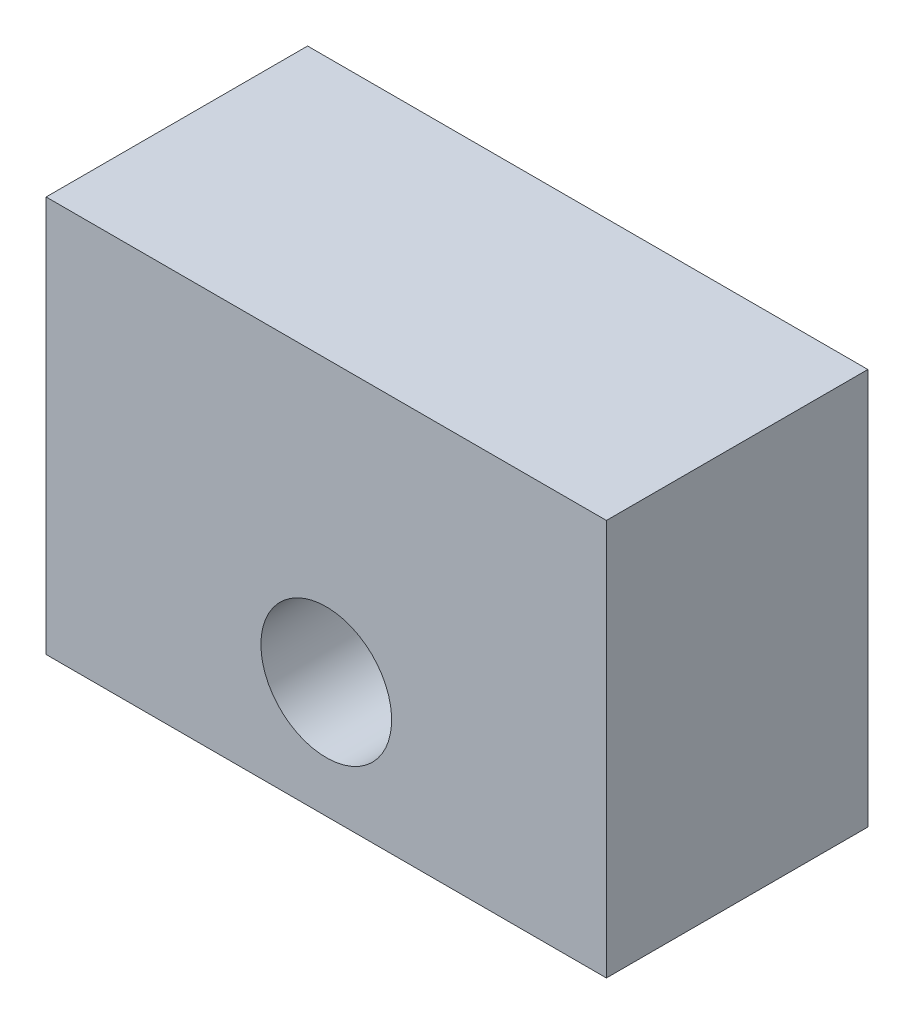
ISO-10303-21;
HEADER;
FILE_DESCRIPTION(('STEP AP214'),'2;1');
FILE_NAME('part.step','',(''),(''),'','','');
FILE_SCHEMA(('AUTOMOTIVE_DESIGN { 1 0 10303 214 1 1 1 1 }'));
ENDSEC;
DATA;
#1=APPLICATION_CONTEXT('core data for automotive mechanical design processes');
#2=APPLICATION_PROTOCOL_DEFINITION('international standard','automotive_design',2000,#1);
#3=PRODUCT_CONTEXT('',#1,'mechanical');
#4=PRODUCT('Part','Part','',(#3));
#5=PRODUCT_RELATED_PRODUCT_CATEGORY('part','',(#4));
#6=PRODUCT_DEFINITION_FORMATION('','',#4);
#7=PRODUCT_DEFINITION_CONTEXT('part definition',#1,'design');
#8=PRODUCT_DEFINITION('design','',#6,#7);
#9=PRODUCT_DEFINITION_SHAPE('','',#8);
#10=(LENGTH_UNIT() NAMED_UNIT(*) SI_UNIT(.MILLI.,.METRE.));
#11=(NAMED_UNIT(*) PLANE_ANGLE_UNIT() SI_UNIT($,.RADIAN.));
#12=(NAMED_UNIT(*) SI_UNIT($,.STERADIAN.) SOLID_ANGLE_UNIT());
#13=UNCERTAINTY_MEASURE_WITH_UNIT(LENGTH_MEASURE(1.E-05),#10,'distance_accuracy_value','');
#14=(GEOMETRIC_REPRESENTATION_CONTEXT(3) GLOBAL_UNCERTAINTY_ASSIGNED_CONTEXT((#13)) GLOBAL_UNIT_ASSIGNED_CONTEXT((#10,
#11,#12)) REPRESENTATION_CONTEXT('',''));
#15=CARTESIAN_POINT('',(0.,0.,0.));
#16=DIRECTION('',(0.,0.,1.));
#17=DIRECTION('',(1.,0.,0.));
#18=AXIS2_PLACEMENT_3D('',#15,#16,#17);
#19=CARTESIAN_POINT('',(7.5,39.11,-30.));
#20=DIRECTION('',(-1.,0.,0.));
#21=DIRECTION('',(0.,0.,1.));
#22=AXIS2_PLACEMENT_3D('',#19,#20,#21);
#23=PLANE('',#22);
#24=DIRECTION('',(0.,-1.,0.));
#25=VECTOR('',#24,1.);
#26=CARTESIAN_POINT('',(7.5,39.11,30.));
#27=LINE('',#26,#25);
#28=CARTESIAN_POINT('',(7.5,39.11,30.));
#29=VERTEX_POINT('',#28);
#30=CARTESIAN_POINT('',(7.5,28.5011069318013,30.));
#31=VERTEX_POINT('',#30);
#32=EDGE_CURVE('E112',#29,#31,#27,.T.);
#33=ORIENTED_EDGE('',*,*,#32,.T.);
#34=DIRECTION('',(0.,0.,-1.));
#35=VECTOR('',#34,1.);
#36=CARTESIAN_POINT('',(7.5,28.5011069318013,-30.));
#37=LINE('',#36,#35);
#38=CARTESIAN_POINT('',(7.5,28.5011069318013,23.));
#39=VERTEX_POINT('',#38);
#40=EDGE_CURVE('E56',#31,#39,#37,.T.);
#41=ORIENTED_EDGE('',*,*,#40,.T.);
#42=DIRECTION('',(0.,1.,0.));
#43=VECTOR('',#42,1.);
#44=CARTESIAN_POINT('',(7.5,39.11,23.));
#45=LINE('',#44,#43);
#46=CARTESIAN_POINT('',(7.5,39.11,23.));
#47=VERTEX_POINT('',#46);
#48=EDGE_CURVE('E91',#39,#47,#45,.T.);
#49=ORIENTED_EDGE('',*,*,#48,.T.);
#50=DIRECTION('',(0.,0.,-1.));
#51=VECTOR('',#50,1.);
#52=CARTESIAN_POINT('',(7.5,39.11,-30.));
#53=LINE('',#52,#51);
#54=EDGE_CURVE('E43',#29,#47,#53,.T.);
#55=ORIENTED_EDGE('',*,*,#54,.F.);
#56=EDGE_LOOP('',(#33,#41,#49,#55));
#57=FACE_BOUND('',#56,.T.);
#58=ADVANCED_FACE('F39',(#57),#23,.F.);
#59=CARTESIAN_POINT('',(-7.5,39.11,-30.));
#60=DIRECTION('',(1.,0.,0.));
#61=DIRECTION('',(0.,0.,-1.));
#62=AXIS2_PLACEMENT_3D('',#59,#60,#61);
#63=PLANE('',#62);
#64=DIRECTION('',(0.,1.,0.));
#65=VECTOR('',#64,1.);
#66=CARTESIAN_POINT('',(-7.5,39.11,23.));
#67=LINE('',#66,#65);
#68=CARTESIAN_POINT('',(-7.5,28.5011069318013,23.));
#69=VERTEX_POINT('',#68);
#70=CARTESIAN_POINT('',(-7.5,39.11,23.));
#71=VERTEX_POINT('',#70);
#72=EDGE_CURVE('E74',#69,#71,#67,.T.);
#73=ORIENTED_EDGE('',*,*,#72,.F.);
#74=DIRECTION('',(0.,0.,1.));
#75=VECTOR('',#74,1.);
#76=CARTESIAN_POINT('',(-7.5,28.5011069318013,-30.));
#77=LINE('',#76,#75);
#78=CARTESIAN_POINT('',(-7.5,28.5011069318013,30.));
#79=VERTEX_POINT('',#78);
#80=EDGE_CURVE('E94',#69,#79,#77,.T.);
#81=ORIENTED_EDGE('',*,*,#80,.T.);
#82=DIRECTION('',(0.,-1.,0.));
#83=VECTOR('',#82,1.);
#84=CARTESIAN_POINT('',(-7.5,39.11,30.));
#85=LINE('',#84,#83);
#86=CARTESIAN_POINT('',(-7.5,39.11,30.));
#87=VERTEX_POINT('',#86);
#88=EDGE_CURVE('E106',#87,#79,#85,.T.);
#89=ORIENTED_EDGE('',*,*,#88,.F.);
#90=DIRECTION('',(0.,0.,1.));
#91=VECTOR('',#90,1.);
#92=CARTESIAN_POINT('',(-7.5,39.11,-30.));
#93=LINE('',#92,#91);
#94=EDGE_CURVE('E108',#71,#87,#93,.T.);
#95=ORIENTED_EDGE('',*,*,#94,.F.);
#96=EDGE_LOOP('',(#73,#81,#89,#95));
#97=FACE_BOUND('',#96,.T.);
#98=ADVANCED_FACE('F129',(#97),#63,.F.);
#99=CARTESIAN_POINT('',(0.,39.11,0.));
#100=DIRECTION('',(0.,1.,0.));
#101=DIRECTION('',(0.,0.,1.));
#102=AXIS2_PLACEMENT_3D('',#99,#100,#101);
#103=PLANE('',#102);
#104=DIRECTION('',(1.,0.,0.));
#105=VECTOR('',#104,1.);
#106=CARTESIAN_POINT('',(0.,39.11,23.));
#107=LINE('',#106,#105);
#108=EDGE_CURVE('E49',#71,#47,#107,.T.);
#109=ORIENTED_EDGE('',*,*,#108,.F.);
#110=ORIENTED_EDGE('',*,*,#94,.T.);
#111=DIRECTION('',(1.,0.,0.));
#112=VECTOR('',#111,1.);
#113=CARTESIAN_POINT('',(-7.5,39.11,30.));
#114=LINE('',#113,#112);
#115=EDGE_CURVE('E83',#87,#29,#114,.T.);
#116=ORIENTED_EDGE('',*,*,#115,.T.);
#117=ORIENTED_EDGE('',*,*,#54,.T.);
#118=EDGE_LOOP('',(#109,#110,#116,#117));
#119=FACE_BOUND('',#118,.T.);
#120=ADVANCED_FACE('F100',(#119),#103,.T.);
#121=CARTESIAN_POINT('',(-7.5,39.11,30.));
#122=DIRECTION('',(0.,0.,-1.));
#123=DIRECTION('',(-1.,0.,0.));
#124=AXIS2_PLACEMENT_3D('',#121,#122,#123);
#125=PLANE('',#124);
#126=CARTESIAN_POINT('',(0.,31.61,30.));
#127=DIRECTION('',(0.,0.,-1.));
#128=DIRECTION('',(-1.,0.,0.));
#129=AXIS2_PLACEMENT_3D('',#126,#127,#128);
#130=CIRCLE('',#129,1.75);
#131=CARTESIAN_POINT('',(-1.75,31.61,30.));
#132=VERTEX_POINT('',#131);
#133=EDGE_CURVE('E102',#132,#132,#130,.T.);
#134=ORIENTED_EDGE('',*,*,#133,.T.);
#135=EDGE_LOOP('',(#134));
#136=FACE_BOUND('',#135,.T.);
#137=ORIENTED_EDGE('',*,*,#88,.T.);
#138=DIRECTION('',(-1.,0.,0.));
#139=VECTOR('',#138,1.);
#140=CARTESIAN_POINT('',(-7.5,28.5011069318013,30.));
#141=LINE('',#140,#139);
#142=EDGE_CURVE('E11',#31,#79,#141,.T.);
#143=ORIENTED_EDGE('',*,*,#142,.F.);
#144=ORIENTED_EDGE('',*,*,#32,.F.);
#145=ORIENTED_EDGE('',*,*,#115,.F.);
#146=EDGE_LOOP('',(#137,#143,#144,#145));
#147=FACE_BOUND('',#146,.T.);
#148=ADVANCED_FACE('F131',(#136,#147),#125,.F.);
#149=CARTESIAN_POINT('',(19.5,39.11,23.));
#150=DIRECTION('',(0.,0.,1.));
#151=DIRECTION('',(0.,-1.,0.));
#152=AXIS2_PLACEMENT_3D('',#149,#150,#151);
#153=PLANE('',#152);
#154=CARTESIAN_POINT('',(0.,31.61,23.));
#155=DIRECTION('',(0.,0.,1.));
#156=DIRECTION('',(0.,-1.,0.));
#157=AXIS2_PLACEMENT_3D('',#154,#155,#156);
#158=CIRCLE('',#157,1.75);
#159=CARTESIAN_POINT('',(0.,29.86,23.));
#160=VERTEX_POINT('',#159);
#161=EDGE_CURVE('E117',#160,#160,#158,.T.);
#162=ORIENTED_EDGE('',*,*,#161,.T.);
#163=EDGE_LOOP('',(#162));
#164=FACE_BOUND('',#163,.T.);
#165=ORIENTED_EDGE('',*,*,#48,.F.);
#166=DIRECTION('',(-1.,0.,0.));
#167=VECTOR('',#166,1.);
#168=CARTESIAN_POINT('',(19.5,28.5011069318013,23.));
#169=LINE('',#168,#167);
#170=EDGE_CURVE('E62',#39,#69,#169,.T.);
#171=ORIENTED_EDGE('',*,*,#170,.T.);
#172=ORIENTED_EDGE('',*,*,#72,.T.);
#173=ORIENTED_EDGE('',*,*,#108,.T.);
#174=EDGE_LOOP('',(#165,#171,#172,#173));
#175=FACE_BOUND('',#174,.T.);
#176=ADVANCED_FACE('F96',(#164,#175),#153,.F.);
#177=CARTESIAN_POINT('',(0.,31.61,30.));
#178=DIRECTION('',(0.,0.,-1.));
#179=DIRECTION('',(-1.,0.,0.));
#180=AXIS2_PLACEMENT_3D('',#177,#178,#179);
#181=CYLINDRICAL_SURFACE('',#180,1.75);
#182=ORIENTED_EDGE('',*,*,#133,.F.);
#183=EDGE_LOOP('',(#182));
#184=FACE_BOUND('',#183,.T.);
#185=ORIENTED_EDGE('',*,*,#161,.F.);
#186=EDGE_LOOP('',(#185));
#187=FACE_BOUND('',#186,.T.);
#188=ADVANCED_FACE('F141',(#184,#187),#181,.F.);
#189=CARTESIAN_POINT('',(-7.5,28.5011069318013,-30.));
#190=DIRECTION('',(0.,1.,0.));
#191=DIRECTION('',(0.,0.,1.));
#192=AXIS2_PLACEMENT_3D('',#189,#190,#191);
#193=PLANE('',#192);
#194=ORIENTED_EDGE('',*,*,#142,.T.);
#195=ORIENTED_EDGE('',*,*,#80,.F.);
#196=ORIENTED_EDGE('',*,*,#170,.F.);
#197=ORIENTED_EDGE('',*,*,#40,.F.);
#198=EDGE_LOOP('',(#194,#195,#196,#197));
#199=FACE_BOUND('',#198,.T.);
#200=ADVANCED_FACE('F41',(#199),#193,.F.);
#201=CLOSED_SHELL('',(#58,#98,#120,#148,#176,#188,#200));
#202=MANIFOLD_SOLID_BREP('B2',#201);
#203=ADVANCED_BREP_SHAPE_REPRESENTATION('',(#18,#202),#14);
#204=SHAPE_DEFINITION_REPRESENTATION(#9,#203);
ENDSEC;
END-ISO-10303-21;
